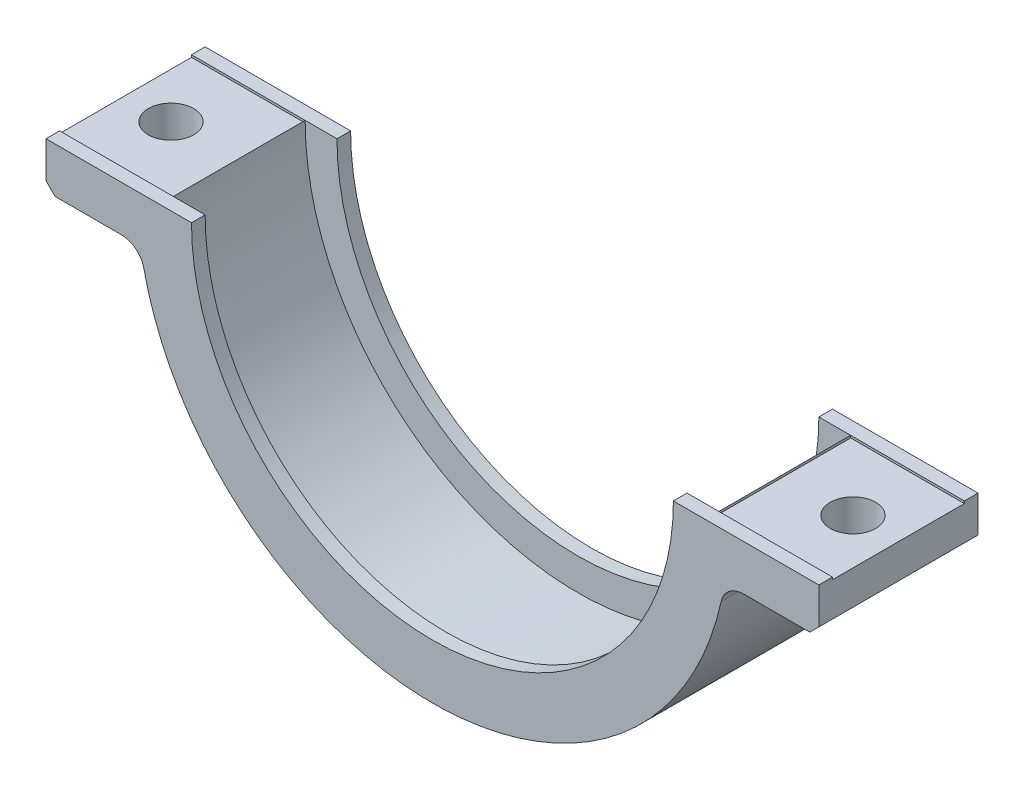
ISO-10303-21;
HEADER;
FILE_DESCRIPTION(('STEP AP214'),'2;1');
FILE_NAME('part.step','',(''),(''),'','','');
FILE_SCHEMA(('AUTOMOTIVE_DESIGN { 1 0 10303 214 1 1 1 1 }'));
ENDSEC;
DATA;
#1=APPLICATION_CONTEXT('core data for automotive mechanical design processes');
#2=APPLICATION_PROTOCOL_DEFINITION('international standard','automotive_design',2000,#1);
#3=PRODUCT_CONTEXT('',#1,'mechanical');
#4=PRODUCT('Part','Part','',(#3));
#5=PRODUCT_RELATED_PRODUCT_CATEGORY('part','',(#4));
#6=PRODUCT_DEFINITION_FORMATION('','',#4);
#7=PRODUCT_DEFINITION_CONTEXT('part definition',#1,'design');
#8=PRODUCT_DEFINITION('design','',#6,#7);
#9=PRODUCT_DEFINITION_SHAPE('','',#8);
#10=(LENGTH_UNIT() NAMED_UNIT(*) SI_UNIT(.MILLI.,.METRE.));
#11=(NAMED_UNIT(*) PLANE_ANGLE_UNIT() SI_UNIT($,.RADIAN.));
#12=(NAMED_UNIT(*) SI_UNIT($,.STERADIAN.) SOLID_ANGLE_UNIT());
#13=UNCERTAINTY_MEASURE_WITH_UNIT(LENGTH_MEASURE(1.E-05),#10,'distance_accuracy_value','');
#14=(GEOMETRIC_REPRESENTATION_CONTEXT(3) GLOBAL_UNCERTAINTY_ASSIGNED_CONTEXT((#13)) GLOBAL_UNIT_ASSIGNED_CONTEXT((#10,
#11,#12)) REPRESENTATION_CONTEXT('',''));
#15=CARTESIAN_POINT('',(0.,0.,0.));
#16=DIRECTION('',(0.,0.,1.));
#17=DIRECTION('',(1.,0.,0.));
#18=AXIS2_PLACEMENT_3D('',#15,#16,#17);
#19=CARTESIAN_POINT('',(0.,0.,14.5));
#20=DIRECTION('',(0.,1.,0.));
#21=DIRECTION('',(-1.,0.,0.));
#22=AXIS2_PLACEMENT_3D('',#19,#20,#21);
#23=PLANE('',#22);
#24=DIRECTION('',(1.,0.,0.));
#25=VECTOR('',#24,1.);
#26=CARTESIAN_POINT('',(0.,0.,14.5));
#27=LINE('',#26,#25);
#28=CARTESIAN_POINT('',(60.,0.,14.5));
#29=VERTEX_POINT('',#28);
#30=CARTESIAN_POINT('',(85.,0.,14.5));
#31=VERTEX_POINT('',#30);
#32=EDGE_CURVE('E206',#29,#31,#27,.T.);
#33=ORIENTED_EDGE('',*,*,#32,.F.);
#34=DIRECTION('',(-1.,0.,0.));
#35=VECTOR('',#34,1.);
#36=CARTESIAN_POINT('',(53.,0.,14.5));
#37=LINE('',#36,#35);
#38=CARTESIAN_POINT('',(53.,0.,14.5));
#39=VERTEX_POINT('',#38);
#40=EDGE_CURVE('E151',#29,#39,#37,.T.);
#41=ORIENTED_EDGE('',*,*,#40,.T.);
#42=DIRECTION('',(0.,0.,-1.));
#43=VECTOR('',#42,1.);
#44=CARTESIAN_POINT('',(53.,0.,17.5));
#45=LINE('',#44,#43);
#46=CARTESIAN_POINT('',(53.,0.,17.5));
#47=VERTEX_POINT('',#46);
#48=EDGE_CURVE('E138',#47,#39,#45,.T.);
#49=ORIENTED_EDGE('',*,*,#48,.F.);
#50=DIRECTION('',(-1.,0.,0.));
#51=VECTOR('',#50,1.);
#52=CARTESIAN_POINT('',(65.,0.,17.5));
#53=LINE('',#52,#51);
#54=CARTESIAN_POINT('',(85.,0.,17.5));
#55=VERTEX_POINT('',#54);
#56=EDGE_CURVE('E131',#55,#47,#53,.T.);
#57=ORIENTED_EDGE('',*,*,#56,.F.);
#58=DIRECTION('',(0.,0.,-1.));
#59=VECTOR('',#58,1.);
#60=CARTESIAN_POINT('',(85.,0.,14.5));
#61=LINE('',#60,#59);
#62=EDGE_CURVE('E113',#55,#31,#61,.T.);
#63=ORIENTED_EDGE('',*,*,#62,.T.);
#64=EDGE_LOOP('',(#33,#41,#49,#57,#63));
#65=FACE_BOUND('',#64,.T.);
#66=ADVANCED_FACE('F32',(#65),#23,.T.);
#67=CARTESIAN_POINT('',(75.,0.,0.));
#68=DIRECTION('',(0.,1.,0.));
#69=DIRECTION('',(0.,0.,1.));
#70=AXIS2_PLACEMENT_3D('',#67,#68,#69);
#71=CYLINDRICAL_SURFACE('',#70,4.99999999999999);
#72=CARTESIAN_POINT('',(75.,-10.,0.));
#73=DIRECTION('',(0.,-1.,0.));
#74=DIRECTION('',(0.,0.,-1.));
#75=AXIS2_PLACEMENT_3D('',#72,#73,#74);
#76=CIRCLE('',#75,4.99999999999999);
#77=CARTESIAN_POINT('',(75.,-10.,-4.99999999999999));
#78=VERTEX_POINT('',#77);
#79=EDGE_CURVE('E252',#78,#78,#76,.T.);
#80=ORIENTED_EDGE('',*,*,#79,.T.);
#81=EDGE_LOOP('',(#80));
#82=FACE_BOUND('',#81,.T.);
#83=CARTESIAN_POINT('',(75.,-0.5,0.));
#84=DIRECTION('',(0.,1.,0.));
#85=DIRECTION('',(0.,0.,1.));
#86=AXIS2_PLACEMENT_3D('',#83,#84,#85);
#87=CIRCLE('',#86,4.99999999999999);
#88=CARTESIAN_POINT('',(75.,-0.5,4.99999999999999));
#89=VERTEX_POINT('',#88);
#90=EDGE_CURVE('E188',#89,#89,#87,.F.);
#91=ORIENTED_EDGE('',*,*,#90,.F.);
#92=EDGE_LOOP('',(#91));
#93=FACE_BOUND('',#92,.T.);
#94=ADVANCED_FACE('F460',(#82,#93),#71,.F.);
#95=CARTESIAN_POINT('',(0.,0.,14.5));
#96=DIRECTION('',(0.,1.,0.));
#97=DIRECTION('',(0.,0.,1.));
#98=AXIS2_PLACEMENT_3D('',#95,#96,#97);
#99=PLANE('',#98);
#100=DIRECTION('',(-1.,0.,0.));
#101=VECTOR('',#100,1.);
#102=CARTESIAN_POINT('',(0.,0.,-14.5));
#103=LINE('',#102,#101);
#104=CARTESIAN_POINT('',(-60.,0.,-14.5));
#105=VERTEX_POINT('',#104);
#106=CARTESIAN_POINT('',(-85.,0.,-14.5));
#107=VERTEX_POINT('',#106);
#108=EDGE_CURVE('E187',#105,#107,#103,.T.);
#109=ORIENTED_EDGE('',*,*,#108,.F.);
#110=DIRECTION('',(1.,0.,0.));
#111=VECTOR('',#110,1.);
#112=CARTESIAN_POINT('',(-53.,0.,-14.5));
#113=LINE('',#112,#111);
#114=CARTESIAN_POINT('',(-53.,0.,-14.5));
#115=VERTEX_POINT('',#114);
#116=EDGE_CURVE('E260',#105,#115,#113,.T.);
#117=ORIENTED_EDGE('',*,*,#116,.T.);
#118=DIRECTION('',(0.,0.,1.));
#119=VECTOR('',#118,1.);
#120=CARTESIAN_POINT('',(-53.,0.,-17.5));
#121=LINE('',#120,#119);
#122=CARTESIAN_POINT('',(-53.,0.,-17.5));
#123=VERTEX_POINT('',#122);
#124=EDGE_CURVE('E154',#123,#115,#121,.T.);
#125=ORIENTED_EDGE('',*,*,#124,.F.);
#126=DIRECTION('',(1.,0.,0.));
#127=VECTOR('',#126,1.);
#128=CARTESIAN_POINT('',(-65.,0.,-17.5));
#129=LINE('',#128,#127);
#130=CARTESIAN_POINT('',(-85.,0.,-17.5));
#131=VERTEX_POINT('',#130);
#132=EDGE_CURVE('E292',#131,#123,#129,.T.);
#133=ORIENTED_EDGE('',*,*,#132,.F.);
#134=DIRECTION('',(0.,0.,-1.));
#135=VECTOR('',#134,1.);
#136=CARTESIAN_POINT('',(-85.,0.,14.5));
#137=LINE('',#136,#135);
#138=EDGE_CURVE('E451',#107,#131,#137,.T.);
#139=ORIENTED_EDGE('',*,*,#138,.F.);
#140=EDGE_LOOP('',(#109,#117,#125,#133,#139));
#141=FACE_BOUND('',#140,.T.);
#142=ADVANCED_FACE('F457',(#141),#99,.T.);
#143=CARTESIAN_POINT('',(-75.,0.,0.));
#144=DIRECTION('',(0.,1.,0.));
#145=DIRECTION('',(0.,0.,1.));
#146=AXIS2_PLACEMENT_3D('',#143,#144,#145);
#147=CYLINDRICAL_SURFACE('',#146,4.99999999999999);
#148=CARTESIAN_POINT('',(-75.,-10.,0.));
#149=DIRECTION('',(0.,1.,0.));
#150=DIRECTION('',(0.,0.,1.));
#151=AXIS2_PLACEMENT_3D('',#148,#149,#150);
#152=CIRCLE('',#151,4.99999999999999);
#153=CARTESIAN_POINT('',(-75.,-10.,4.99999999999999));
#154=VERTEX_POINT('',#153);
#155=EDGE_CURVE('E257',#154,#154,#152,.T.);
#156=ORIENTED_EDGE('',*,*,#155,.F.);
#157=EDGE_LOOP('',(#156));
#158=FACE_BOUND('',#157,.T.);
#159=CARTESIAN_POINT('',(-75.,-0.5,0.));
#160=DIRECTION('',(0.,1.,0.));
#161=DIRECTION('',(0.,0.,1.));
#162=AXIS2_PLACEMENT_3D('',#159,#160,#161);
#163=CIRCLE('',#162,4.99999999999999);
#164=CARTESIAN_POINT('',(-75.,-0.5,4.99999999999999));
#165=VERTEX_POINT('',#164);
#166=EDGE_CURVE('E198',#165,#165,#163,.F.);
#167=ORIENTED_EDGE('',*,*,#166,.F.);
#168=EDGE_LOOP('',(#167));
#169=FACE_BOUND('',#168,.T.);
#170=ADVANCED_FACE('F459',(#158,#169),#147,.F.);
#171=CARTESIAN_POINT('',(0.,-10.,14.5));
#172=DIRECTION('',(0.,1.,0.));
#173=DIRECTION('',(0.,0.,1.));
#174=AXIS2_PLACEMENT_3D('',#171,#172,#173);
#175=PLANE('',#174);
#176=ORIENTED_EDGE('',*,*,#155,.T.);
#177=EDGE_LOOP('',(#176));
#178=FACE_BOUND('',#177,.T.);
#179=DIRECTION('',(0.,0.,-1.));
#180=VECTOR('',#179,1.);
#181=CARTESIAN_POINT('',(-83.,-10.,14.5));
#182=LINE('',#181,#180);
#183=CARTESIAN_POINT('',(-83.,-10.,17.5));
#184=VERTEX_POINT('',#183);
#185=CARTESIAN_POINT('',(-83.,-10.,-17.5));
#186=VERTEX_POINT('',#185);
#187=EDGE_CURVE('E165',#184,#186,#182,.T.);
#188=ORIENTED_EDGE('',*,*,#187,.T.);
#189=DIRECTION('',(-1.,0.,0.));
#190=VECTOR('',#189,1.);
#191=CARTESIAN_POINT('',(-83.,-10.,-17.5));
#192=LINE('',#191,#190);
#193=CARTESIAN_POINT('',(-68.3739716558867,-10.,-17.5));
#194=VERTEX_POINT('',#193);
#195=EDGE_CURVE('E283',#194,#186,#192,.T.);
#196=ORIENTED_EDGE('',*,*,#195,.F.);
#197=DIRECTION('',(0.,0.,-1.));
#198=VECTOR('',#197,1.);
#199=CARTESIAN_POINT('',(-68.3739716558867,-10.,14.5));
#200=LINE('',#199,#198);
#201=CARTESIAN_POINT('',(-68.3739716558867,-10.,17.5));
#202=VERTEX_POINT('',#201);
#203=EDGE_CURVE('E11',#202,#194,#200,.T.);
#204=ORIENTED_EDGE('',*,*,#203,.F.);
#205=DIRECTION('',(1.,0.,0.));
#206=VECTOR('',#205,1.);
#207=CARTESIAN_POINT('',(-83.,-10.,17.5));
#208=LINE('',#207,#206);
#209=EDGE_CURVE('E315',#184,#202,#208,.T.);
#210=ORIENTED_EDGE('',*,*,#209,.F.);
#211=EDGE_LOOP('',(#188,#196,#204,#210));
#212=FACE_BOUND('',#211,.T.);
#213=ADVANCED_FACE('F34',(#178,#212),#175,.F.);
#214=CARTESIAN_POINT('',(-68.3739716558867,-15.,14.5));
#215=DIRECTION('',(0.,0.,-1.));
#216=DIRECTION('',(-1.,0.,0.));
#217=AXIS2_PLACEMENT_3D('',#214,#215,#216);
#218=CYLINDRICAL_SURFACE('',#217,5.);
#219=ORIENTED_EDGE('',*,*,#203,.T.);
#220=CARTESIAN_POINT('',(-68.3739716558867,-15.,-17.5));
#221=DIRECTION('',(0.,0.,1.));
#222=DIRECTION('',(-1.,0.,0.));
#223=AXIS2_PLACEMENT_3D('',#220,#221,#222);
#224=CIRCLE('',#223,4.99999999999999);
#225=CARTESIAN_POINT('',(-63.4901165376091,-13.9285714285714,-17.5));
#226=VERTEX_POINT('',#225);
#227=EDGE_CURVE('E280',#226,#194,#224,.T.);
#228=ORIENTED_EDGE('',*,*,#227,.F.);
#229=DIRECTION('',(0.,0.,-1.));
#230=VECTOR('',#229,1.);
#231=CARTESIAN_POINT('',(-63.4901165376091,-13.9285714285714,14.5));
#232=LINE('',#231,#230);
#233=CARTESIAN_POINT('',(-63.4901165376091,-13.9285714285714,17.5));
#234=VERTEX_POINT('',#233);
#235=EDGE_CURVE('E41',#234,#226,#232,.T.);
#236=ORIENTED_EDGE('',*,*,#235,.F.);
#237=CARTESIAN_POINT('',(-68.3739716558867,-15.,17.5));
#238=DIRECTION('',(0.,0.,-1.));
#239=DIRECTION('',(-1.,0.,0.));
#240=AXIS2_PLACEMENT_3D('',#237,#238,#239);
#241=CIRCLE('',#240,4.99999999999999);
#242=EDGE_CURVE('E318',#202,#234,#241,.T.);
#243=ORIENTED_EDGE('',*,*,#242,.F.);
#244=EDGE_LOOP('',(#219,#228,#236,#243));
#245=FACE_BOUND('',#244,.T.);
#246=ADVANCED_FACE('F500',(#245),#218,.F.);
#247=CARTESIAN_POINT('',(0.,0.,14.5));
#248=DIRECTION('',(0.,0.,-1.));
#249=DIRECTION('',(-1.,0.,0.));
#250=AXIS2_PLACEMENT_3D('',#247,#248,#249);
#251=CYLINDRICAL_SURFACE('',#250,65.);
#252=ORIENTED_EDGE('',*,*,#235,.T.);
#253=CARTESIAN_POINT('',(0.,0.,-17.5));
#254=DIRECTION('',(0.,0.,-1.));
#255=DIRECTION('',(-1.,0.,0.));
#256=AXIS2_PLACEMENT_3D('',#253,#254,#255);
#257=CIRCLE('',#256,65.);
#258=CARTESIAN_POINT('',(63.4901165376091,-13.9285714285714,-17.5));
#259=VERTEX_POINT('',#258);
#260=EDGE_CURVE('E277',#259,#226,#257,.T.);
#261=ORIENTED_EDGE('',*,*,#260,.F.);
#262=DIRECTION('',(0.,0.,-1.));
#263=VECTOR('',#262,1.);
#264=CARTESIAN_POINT('',(63.4901165376091,-13.9285714285715,14.5));
#265=LINE('',#264,#263);
#266=CARTESIAN_POINT('',(63.4901165376091,-13.9285714285714,17.5));
#267=VERTEX_POINT('',#266);
#268=EDGE_CURVE('E346',#267,#259,#265,.T.);
#269=ORIENTED_EDGE('',*,*,#268,.F.);
#270=CARTESIAN_POINT('',(0.,0.,17.5));
#271=DIRECTION('',(0.,0.,1.));
#272=DIRECTION('',(1.,0.,0.));
#273=AXIS2_PLACEMENT_3D('',#270,#271,#272);
#274=CIRCLE('',#273,65.);
#275=EDGE_CURVE('E321',#234,#267,#274,.T.);
#276=ORIENTED_EDGE('',*,*,#275,.F.);
#277=EDGE_LOOP('',(#252,#261,#269,#276));
#278=FACE_BOUND('',#277,.T.);
#279=ADVANCED_FACE('F497',(#278),#251,.T.);
#280=CARTESIAN_POINT('',(68.3739716558867,-15.,14.5));
#281=DIRECTION('',(0.,0.,-1.));
#282=DIRECTION('',(-1.,0.,0.));
#283=AXIS2_PLACEMENT_3D('',#280,#281,#282);
#284=CYLINDRICAL_SURFACE('',#283,5.);
#285=ORIENTED_EDGE('',*,*,#268,.T.);
#286=CARTESIAN_POINT('',(68.3739716558867,-15.,-17.5));
#287=DIRECTION('',(0.,0.,1.));
#288=DIRECTION('',(1.,0.,0.));
#289=AXIS2_PLACEMENT_3D('',#286,#287,#288);
#290=CIRCLE('',#289,4.99999999999999);
#291=CARTESIAN_POINT('',(68.3739716558867,-10.,-17.5));
#292=VERTEX_POINT('',#291);
#293=EDGE_CURVE('E274',#292,#259,#290,.T.);
#294=ORIENTED_EDGE('',*,*,#293,.F.);
#295=DIRECTION('',(0.,0.,-1.));
#296=VECTOR('',#295,1.);
#297=CARTESIAN_POINT('',(68.3739716558867,-10.,14.5));
#298=LINE('',#297,#296);
#299=CARTESIAN_POINT('',(68.3739716558867,-10.,17.5));
#300=VERTEX_POINT('',#299);
#301=EDGE_CURVE('E341',#300,#292,#298,.T.);
#302=ORIENTED_EDGE('',*,*,#301,.F.);
#303=CARTESIAN_POINT('',(68.3739716558867,-15.,17.5));
#304=DIRECTION('',(0.,0.,-1.));
#305=DIRECTION('',(1.,0.,0.));
#306=AXIS2_PLACEMENT_3D('',#303,#304,#305);
#307=CIRCLE('',#306,5.);
#308=EDGE_CURVE('E324',#267,#300,#307,.T.);
#309=ORIENTED_EDGE('',*,*,#308,.F.);
#310=EDGE_LOOP('',(#285,#294,#302,#309));
#311=FACE_BOUND('',#310,.T.);
#312=ADVANCED_FACE('F493',(#311),#284,.F.);
#313=CARTESIAN_POINT('',(0.,-10.,14.5));
#314=DIRECTION('',(0.,-1.,0.));
#315=DIRECTION('',(0.,0.,-1.));
#316=AXIS2_PLACEMENT_3D('',#313,#314,#315);
#317=PLANE('',#316);
#318=ORIENTED_EDGE('',*,*,#79,.F.);
#319=EDGE_LOOP('',(#318));
#320=FACE_BOUND('',#319,.T.);
#321=ORIENTED_EDGE('',*,*,#301,.T.);
#322=DIRECTION('',(-1.,0.,0.));
#323=VECTOR('',#322,1.);
#324=CARTESIAN_POINT('',(83.,-10.,-17.5));
#325=LINE('',#324,#323);
#326=CARTESIAN_POINT('',(83.,-10.,-17.5));
#327=VERTEX_POINT('',#326);
#328=EDGE_CURVE('E271',#327,#292,#325,.T.);
#329=ORIENTED_EDGE('',*,*,#328,.F.);
#330=DIRECTION('',(0.,0.,-1.));
#331=VECTOR('',#330,1.);
#332=CARTESIAN_POINT('',(83.,-10.,14.5));
#333=LINE('',#332,#331);
#334=CARTESIAN_POINT('',(83.,-10.,17.5));
#335=VERTEX_POINT('',#334);
#336=EDGE_CURVE('E337',#335,#327,#333,.T.);
#337=ORIENTED_EDGE('',*,*,#336,.F.);
#338=DIRECTION('',(1.,0.,0.));
#339=VECTOR('',#338,1.);
#340=CARTESIAN_POINT('',(83.,-10.,17.5));
#341=LINE('',#340,#339);
#342=EDGE_CURVE('E327',#300,#335,#341,.T.);
#343=ORIENTED_EDGE('',*,*,#342,.F.);
#344=EDGE_LOOP('',(#321,#329,#337,#343));
#345=FACE_BOUND('',#344,.T.);
#346=ADVANCED_FACE('F488',(#320,#345),#317,.T.);
#347=CARTESIAN_POINT('',(46.5,-46.5,14.5));
#348=DIRECTION('',(0.707106781186547,-0.707106781186548,0.));
#349=DIRECTION('',(0.707106781186548,0.707106781186547,0.));
#350=AXIS2_PLACEMENT_3D('',#347,#348,#349);
#351=PLANE('',#350);
#352=ORIENTED_EDGE('',*,*,#336,.T.);
#353=DIRECTION('',(-0.707106781186547,-0.707106781186547,0.));
#354=VECTOR('',#353,1.);
#355=CARTESIAN_POINT('',(85.,-8.,-17.5));
#356=LINE('',#355,#354);
#357=CARTESIAN_POINT('',(85.,-8.,-17.5));
#358=VERTEX_POINT('',#357);
#359=EDGE_CURVE('E268',#358,#327,#356,.T.);
#360=ORIENTED_EDGE('',*,*,#359,.F.);
#361=DIRECTION('',(0.,0.,-1.));
#362=VECTOR('',#361,1.);
#363=CARTESIAN_POINT('',(85.,-8.,14.5));
#364=LINE('',#363,#362);
#365=CARTESIAN_POINT('',(85.,-8.,17.5));
#366=VERTEX_POINT('',#365);
#367=EDGE_CURVE('E125',#366,#358,#364,.T.);
#368=ORIENTED_EDGE('',*,*,#367,.F.);
#369=DIRECTION('',(0.707106781186548,0.707106781186547,0.));
#370=VECTOR('',#369,1.);
#371=CARTESIAN_POINT('',(85.,-8.,17.5));
#372=LINE('',#371,#370);
#373=EDGE_CURVE('E135',#335,#366,#372,.T.);
#374=ORIENTED_EDGE('',*,*,#373,.F.);
#375=EDGE_LOOP('',(#352,#360,#368,#374));
#376=FACE_BOUND('',#375,.T.);
#377=ADVANCED_FACE('F334',(#376),#351,.T.);
#378=CARTESIAN_POINT('',(85.,0.,14.5));
#379=DIRECTION('',(1.,0.,0.));
#380=DIRECTION('',(0.,0.,-1.));
#381=AXIS2_PLACEMENT_3D('',#378,#379,#380);
#382=PLANE('',#381);
#383=DIRECTION('',(0.,1.,0.));
#384=VECTOR('',#383,1.);
#385=CARTESIAN_POINT('',(85.,-0.5,14.5));
#386=LINE('',#385,#384);
#387=CARTESIAN_POINT('',(85.,-0.5,14.5));
#388=VERTEX_POINT('',#387);
#389=EDGE_CURVE('E121',#388,#31,#386,.T.);
#390=ORIENTED_EDGE('',*,*,#389,.T.);
#391=ORIENTED_EDGE('',*,*,#62,.F.);
#392=DIRECTION('',(0.,1.,0.));
#393=VECTOR('',#392,1.);
#394=CARTESIAN_POINT('',(85.,0.,17.5));
#395=LINE('',#394,#393);
#396=EDGE_CURVE('E117',#366,#55,#395,.T.);
#397=ORIENTED_EDGE('',*,*,#396,.F.);
#398=ORIENTED_EDGE('',*,*,#367,.T.);
#399=DIRECTION('',(0.,-1.,0.));
#400=VECTOR('',#399,1.);
#401=CARTESIAN_POINT('',(85.,0.,-17.5));
#402=LINE('',#401,#400);
#403=CARTESIAN_POINT('',(85.,0.,-17.5));
#404=VERTEX_POINT('',#403);
#405=EDGE_CURVE('E264',#404,#358,#402,.T.);
#406=ORIENTED_EDGE('',*,*,#405,.F.);
#407=CARTESIAN_POINT('',(85.,0.,-14.5));
#408=VERTEX_POINT('',#407);
#409=EDGE_CURVE('E126',#408,#404,#61,.T.);
#410=ORIENTED_EDGE('',*,*,#409,.F.);
#411=DIRECTION('',(0.,1.,0.));
#412=VECTOR('',#411,1.);
#413=CARTESIAN_POINT('',(85.,-0.5,-14.5));
#414=LINE('',#413,#412);
#415=CARTESIAN_POINT('',(85.,-0.5,-14.5));
#416=VERTEX_POINT('',#415);
#417=EDGE_CURVE('E213',#416,#408,#414,.T.);
#418=ORIENTED_EDGE('',*,*,#417,.F.);
#419=DIRECTION('',(0.,0.,-1.));
#420=VECTOR('',#419,1.);
#421=CARTESIAN_POINT('',(85.,-0.5,0.));
#422=LINE('',#421,#420);
#423=EDGE_CURVE('E220',#388,#416,#422,.T.);
#424=ORIENTED_EDGE('',*,*,#423,.F.);
#425=EDGE_LOOP('',(#390,#391,#397,#398,#406,#410,#418,#424));
#426=FACE_BOUND('',#425,.T.);
#427=ADVANCED_FACE('F115',(#426),#382,.T.);
#428=DIRECTION('',(-1.,0.,0.));
#429=VECTOR('',#428,1.);
#430=CARTESIAN_POINT('',(0.,0.,-14.5));
#431=LINE('',#430,#429);
#432=CARTESIAN_POINT('',(60.,0.,-14.5));
#433=VERTEX_POINT('',#432);
#434=EDGE_CURVE('E203',#408,#433,#431,.T.);
#435=ORIENTED_EDGE('',*,*,#434,.F.);
#436=ORIENTED_EDGE('',*,*,#409,.T.);
#437=DIRECTION('',(1.,0.,0.));
#438=VECTOR('',#437,1.);
#439=CARTESIAN_POINT('',(65.,0.,-17.5));
#440=LINE('',#439,#438);
#441=CARTESIAN_POINT('',(53.,0.,-17.5));
#442=VERTEX_POINT('',#441);
#443=EDGE_CURVE('E261',#442,#404,#440,.T.);
#444=ORIENTED_EDGE('',*,*,#443,.F.);
#445=DIRECTION('',(0.,0.,1.));
#446=VECTOR('',#445,1.);
#447=CARTESIAN_POINT('',(53.,0.,-17.5));
#448=LINE('',#447,#446);
#449=CARTESIAN_POINT('',(53.,0.,-14.5));
#450=VERTEX_POINT('',#449);
#451=EDGE_CURVE('E298',#442,#450,#448,.T.);
#452=ORIENTED_EDGE('',*,*,#451,.T.);
#453=DIRECTION('',(1.,0.,0.));
#454=VECTOR('',#453,1.);
#455=CARTESIAN_POINT('',(65.,0.,-14.5));
#456=LINE('',#455,#454);
#457=EDGE_CURVE('E265',#450,#433,#456,.T.);
#458=ORIENTED_EDGE('',*,*,#457,.T.);
#459=EDGE_LOOP('',(#435,#436,#444,#452,#458));
#460=FACE_BOUND('',#459,.T.);
#461=ADVANCED_FACE('F360',(#460),#23,.T.);
#462=CARTESIAN_POINT('',(0.,0.,14.5));
#463=DIRECTION('',(0.,0.,-1.));
#464=DIRECTION('',(-1.,0.,0.));
#465=AXIS2_PLACEMENT_3D('',#462,#463,#464);
#466=CYLINDRICAL_SURFACE('',#465,60.);
#467=CARTESIAN_POINT('',(0.,0.,-14.5));
#468=DIRECTION('',(0.,0.,1.));
#469=DIRECTION('',(1.,0.,0.));
#470=AXIS2_PLACEMENT_3D('',#467,#468,#469);
#471=CIRCLE('',#470,60.);
#472=EDGE_CURVE('E166',#105,#433,#471,.T.);
#473=ORIENTED_EDGE('',*,*,#472,.F.);
#474=DIRECTION('',(0.,0.,-1.));
#475=VECTOR('',#474,1.);
#476=CARTESIAN_POINT('',(-60.,0.,14.5));
#477=LINE('',#476,#475);
#478=CARTESIAN_POINT('',(-60.,0.,14.5));
#479=VERTEX_POINT('',#478);
#480=EDGE_CURVE('E169',#479,#105,#477,.T.);
#481=ORIENTED_EDGE('',*,*,#480,.F.);
#482=CARTESIAN_POINT('',(0.,0.,14.5));
#483=DIRECTION('',(0.,0.,1.));
#484=DIRECTION('',(1.,0.,0.));
#485=AXIS2_PLACEMENT_3D('',#482,#483,#484);
#486=CIRCLE('',#485,60.);
#487=EDGE_CURVE('E161',#479,#29,#486,.T.);
#488=ORIENTED_EDGE('',*,*,#487,.T.);
#489=DIRECTION('',(0.,0.,-1.));
#490=VECTOR('',#489,1.);
#491=CARTESIAN_POINT('',(60.,0.,14.5));
#492=LINE('',#491,#490);
#493=EDGE_CURVE('E172',#29,#433,#492,.T.);
#494=ORIENTED_EDGE('',*,*,#493,.T.);
#495=EDGE_LOOP('',(#473,#481,#488,#494));
#496=FACE_BOUND('',#495,.T.);
#497=ADVANCED_FACE('F474',(#496),#466,.F.);
#498=DIRECTION('',(1.,0.,0.));
#499=VECTOR('',#498,1.);
#500=CARTESIAN_POINT('',(0.,0.,14.5));
#501=LINE('',#500,#499);
#502=CARTESIAN_POINT('',(-85.,0.,14.5));
#503=VERTEX_POINT('',#502);
#504=EDGE_CURVE('E184',#503,#479,#501,.T.);
#505=ORIENTED_EDGE('',*,*,#504,.F.);
#506=CARTESIAN_POINT('',(-85.,0.,17.5));
#507=VERTEX_POINT('',#506);
#508=EDGE_CURVE('E81',#507,#503,#137,.T.);
#509=ORIENTED_EDGE('',*,*,#508,.F.);
#510=DIRECTION('',(-1.,0.,0.));
#511=VECTOR('',#510,1.);
#512=CARTESIAN_POINT('',(-65.,0.,17.5));
#513=LINE('',#512,#511);
#514=CARTESIAN_POINT('',(-53.,0.,17.5));
#515=VERTEX_POINT('',#514);
#516=EDGE_CURVE('E58',#515,#507,#513,.T.);
#517=ORIENTED_EDGE('',*,*,#516,.F.);
#518=DIRECTION('',(0.,0.,-1.));
#519=VECTOR('',#518,1.);
#520=CARTESIAN_POINT('',(-53.,0.,17.5));
#521=LINE('',#520,#519);
#522=CARTESIAN_POINT('',(-53.,0.,14.5));
#523=VERTEX_POINT('',#522);
#524=EDGE_CURVE('E142',#515,#523,#521,.T.);
#525=ORIENTED_EDGE('',*,*,#524,.T.);
#526=DIRECTION('',(-1.,0.,0.));
#527=VECTOR('',#526,1.);
#528=CARTESIAN_POINT('',(-65.,0.,14.5));
#529=LINE('',#528,#527);
#530=EDGE_CURVE('E75',#523,#479,#529,.T.);
#531=ORIENTED_EDGE('',*,*,#530,.T.);
#532=EDGE_LOOP('',(#505,#509,#517,#525,#531));
#533=FACE_BOUND('',#532,.T.);
#534=ADVANCED_FACE('F462',(#533),#99,.T.);
#535=CARTESIAN_POINT('',(-85.,0.,14.5));
#536=DIRECTION('',(1.,0.,0.));
#537=DIRECTION('',(0.,0.,-1.));
#538=AXIS2_PLACEMENT_3D('',#535,#536,#537);
#539=PLANE('',#538);
#540=DIRECTION('',(0.,0.,1.));
#541=VECTOR('',#540,1.);
#542=CARTESIAN_POINT('',(-85.,-0.5,0.));
#543=LINE('',#542,#541);
#544=CARTESIAN_POINT('',(-85.,-0.5,-14.5));
#545=VERTEX_POINT('',#544);
#546=CARTESIAN_POINT('',(-85.,-0.5,14.5));
#547=VERTEX_POINT('',#546);
#548=EDGE_CURVE('E242',#545,#547,#543,.T.);
#549=ORIENTED_EDGE('',*,*,#548,.F.);
#550=DIRECTION('',(0.,1.,0.));
#551=VECTOR('',#550,1.);
#552=CARTESIAN_POINT('',(-85.,-0.5,-14.5));
#553=LINE('',#552,#551);
#554=EDGE_CURVE('E193',#545,#107,#553,.T.);
#555=ORIENTED_EDGE('',*,*,#554,.T.);
#556=ORIENTED_EDGE('',*,*,#138,.T.);
#557=DIRECTION('',(0.,1.,0.));
#558=VECTOR('',#557,1.);
#559=CARTESIAN_POINT('',(-85.,0.,-17.5));
#560=LINE('',#559,#558);
#561=CARTESIAN_POINT('',(-85.,-8.,-17.5));
#562=VERTEX_POINT('',#561);
#563=EDGE_CURVE('E289',#562,#131,#560,.T.);
#564=ORIENTED_EDGE('',*,*,#563,.F.);
#565=DIRECTION('',(0.,0.,-1.));
#566=VECTOR('',#565,1.);
#567=CARTESIAN_POINT('',(-85.,-8.,14.5));
#568=LINE('',#567,#566);
#569=CARTESIAN_POINT('',(-85.,-8.,17.5));
#570=VERTEX_POINT('',#569);
#571=EDGE_CURVE('E455',#570,#562,#568,.T.);
#572=ORIENTED_EDGE('',*,*,#571,.F.);
#573=DIRECTION('',(0.,-1.,0.));
#574=VECTOR('',#573,1.);
#575=CARTESIAN_POINT('',(-85.,0.,17.5));
#576=LINE('',#575,#574);
#577=EDGE_CURVE('E309',#507,#570,#576,.T.);
#578=ORIENTED_EDGE('',*,*,#577,.F.);
#579=ORIENTED_EDGE('',*,*,#508,.T.);
#580=DIRECTION('',(0.,1.,0.));
#581=VECTOR('',#580,1.);
#582=CARTESIAN_POINT('',(-85.,-0.5,14.5));
#583=LINE('',#582,#581);
#584=EDGE_CURVE('E181',#547,#503,#583,.T.);
#585=ORIENTED_EDGE('',*,*,#584,.F.);
#586=EDGE_LOOP('',(#549,#555,#556,#564,#572,#578,#579,#585));
#587=FACE_BOUND('',#586,.T.);
#588=ADVANCED_FACE('F453',(#587),#539,.F.);
#589=CARTESIAN_POINT('',(-46.5,-46.5,14.5));
#590=DIRECTION('',(0.707106781186547,0.707106781186548,0.));
#591=DIRECTION('',(-0.707106781186548,0.707106781186547,0.));
#592=AXIS2_PLACEMENT_3D('',#589,#590,#591);
#593=PLANE('',#592);
#594=ORIENTED_EDGE('',*,*,#571,.T.);
#595=DIRECTION('',(-0.707106781186547,0.707106781186547,0.));
#596=VECTOR('',#595,1.);
#597=CARTESIAN_POINT('',(-85.,-8.,-17.5));
#598=LINE('',#597,#596);
#599=EDGE_CURVE('E286',#186,#562,#598,.T.);
#600=ORIENTED_EDGE('',*,*,#599,.F.);
#601=ORIENTED_EDGE('',*,*,#187,.F.);
#602=DIRECTION('',(0.707106781186548,-0.707106781186547,0.));
#603=VECTOR('',#602,1.);
#604=CARTESIAN_POINT('',(-85.,-8.,17.5));
#605=LINE('',#604,#603);
#606=EDGE_CURVE('E312',#570,#184,#605,.T.);
#607=ORIENTED_EDGE('',*,*,#606,.F.);
#608=EDGE_LOOP('',(#594,#600,#601,#607));
#609=FACE_BOUND('',#608,.T.);
#610=ADVANCED_FACE('F561',(#609),#593,.F.);
#611=CARTESIAN_POINT('',(-68.3739716558867,-15.,14.5));
#612=DIRECTION('',(0.,0.,-1.));
#613=DIRECTION('',(-1.,0.,0.));
#614=AXIS2_PLACEMENT_3D('',#611,#612,#613);
#615=PLANE('',#614);
#616=ORIENTED_EDGE('',*,*,#487,.F.);
#617=ORIENTED_EDGE('',*,*,#530,.F.);
#618=CARTESIAN_POINT('',(0.,0.,14.5));
#619=DIRECTION('',(0.,0.,-1.));
#620=DIRECTION('',(1.,0.,0.));
#621=AXIS2_PLACEMENT_3D('',#618,#619,#620);
#622=CIRCLE('',#621,53.);
#623=EDGE_CURVE('E148',#39,#523,#622,.T.);
#624=ORIENTED_EDGE('',*,*,#623,.F.);
#625=ORIENTED_EDGE('',*,*,#40,.F.);
#626=EDGE_LOOP('',(#616,#617,#624,#625));
#627=FACE_BOUND('',#626,.T.);
#628=ADVANCED_FACE('F524',(#627),#615,.T.);
#629=CARTESIAN_POINT('',(0.,0.,17.5));
#630=DIRECTION('',(0.,0.,-1.));
#631=DIRECTION('',(-1.,0.,0.));
#632=AXIS2_PLACEMENT_3D('',#629,#630,#631);
#633=CYLINDRICAL_SURFACE('',#632,53.);
#634=ORIENTED_EDGE('',*,*,#623,.T.);
#635=ORIENTED_EDGE('',*,*,#524,.F.);
#636=CARTESIAN_POINT('',(0.,0.,17.5));
#637=DIRECTION('',(0.,0.,-1.));
#638=DIRECTION('',(1.,0.,0.));
#639=AXIS2_PLACEMENT_3D('',#636,#637,#638);
#640=CIRCLE('',#639,53.);
#641=EDGE_CURVE('E140',#47,#515,#640,.T.);
#642=ORIENTED_EDGE('',*,*,#641,.F.);
#643=ORIENTED_EDGE('',*,*,#48,.T.);
#644=EDGE_LOOP('',(#634,#635,#642,#643));
#645=FACE_BOUND('',#644,.T.);
#646=ADVANCED_FACE('F520',(#645),#633,.F.);
#647=CARTESIAN_POINT('',(-68.3739716558867,-15.,17.5));
#648=DIRECTION('',(0.,0.,-1.));
#649=DIRECTION('',(-1.,0.,0.));
#650=AXIS2_PLACEMENT_3D('',#647,#648,#649);
#651=PLANE('',#650);
#652=ORIENTED_EDGE('',*,*,#516,.T.);
#653=ORIENTED_EDGE('',*,*,#577,.T.);
#654=ORIENTED_EDGE('',*,*,#606,.T.);
#655=ORIENTED_EDGE('',*,*,#209,.T.);
#656=ORIENTED_EDGE('',*,*,#242,.T.);
#657=ORIENTED_EDGE('',*,*,#275,.T.);
#658=ORIENTED_EDGE('',*,*,#308,.T.);
#659=ORIENTED_EDGE('',*,*,#342,.T.);
#660=ORIENTED_EDGE('',*,*,#373,.T.);
#661=ORIENTED_EDGE('',*,*,#396,.T.);
#662=ORIENTED_EDGE('',*,*,#56,.T.);
#663=ORIENTED_EDGE('',*,*,#641,.T.);
#664=EDGE_LOOP('',(#652,#653,#654,#655,#656,#657,#658,#659,#660,#661,#662,#663));
#665=FACE_BOUND('',#664,.T.);
#666=ADVANCED_FACE('F130',(#665),#651,.F.);
#667=CARTESIAN_POINT('',(0.,0.,-17.5));
#668=DIRECTION('',(0.,0.,1.));
#669=DIRECTION('',(1.,0.,0.));
#670=AXIS2_PLACEMENT_3D('',#667,#668,#669);
#671=CYLINDRICAL_SURFACE('',#670,53.);
#672=CARTESIAN_POINT('',(0.,0.,-14.5));
#673=DIRECTION('',(0.,0.,1.));
#674=DIRECTION('',(-1.,0.,0.));
#675=AXIS2_PLACEMENT_3D('',#672,#673,#674);
#676=CIRCLE('',#675,53.);
#677=EDGE_CURVE('E301',#115,#450,#676,.T.);
#678=ORIENTED_EDGE('',*,*,#677,.T.);
#679=ORIENTED_EDGE('',*,*,#451,.F.);
#680=CARTESIAN_POINT('',(0.,0.,-17.5));
#681=DIRECTION('',(0.,0.,1.));
#682=DIRECTION('',(-1.,0.,0.));
#683=AXIS2_PLACEMENT_3D('',#680,#681,#682);
#684=CIRCLE('',#683,53.);
#685=EDGE_CURVE('E295',#123,#442,#684,.T.);
#686=ORIENTED_EDGE('',*,*,#685,.F.);
#687=ORIENTED_EDGE('',*,*,#124,.T.);
#688=EDGE_LOOP('',(#678,#679,#686,#687));
#689=FACE_BOUND('',#688,.T.);
#690=ADVANCED_FACE('F378',(#689),#671,.F.);
#691=CARTESIAN_POINT('',(68.3739716558867,-15.,-17.5));
#692=DIRECTION('',(0.,0.,1.));
#693=DIRECTION('',(1.,0.,0.));
#694=AXIS2_PLACEMENT_3D('',#691,#692,#693);
#695=PLANE('',#694);
#696=ORIENTED_EDGE('',*,*,#443,.T.);
#697=ORIENTED_EDGE('',*,*,#405,.T.);
#698=ORIENTED_EDGE('',*,*,#359,.T.);
#699=ORIENTED_EDGE('',*,*,#328,.T.);
#700=ORIENTED_EDGE('',*,*,#293,.T.);
#701=ORIENTED_EDGE('',*,*,#260,.T.);
#702=ORIENTED_EDGE('',*,*,#227,.T.);
#703=ORIENTED_EDGE('',*,*,#195,.T.);
#704=ORIENTED_EDGE('',*,*,#599,.T.);
#705=ORIENTED_EDGE('',*,*,#563,.T.);
#706=ORIENTED_EDGE('',*,*,#132,.T.);
#707=ORIENTED_EDGE('',*,*,#685,.T.);
#708=EDGE_LOOP('',(#696,#697,#698,#699,#700,#701,#702,#703,#704,#705,#706,#707));
#709=FACE_BOUND('',#708,.T.);
#710=ADVANCED_FACE('F368',(#709),#695,.F.);
#711=CARTESIAN_POINT('',(68.3739716558867,-15.,-14.5));
#712=DIRECTION('',(0.,0.,1.));
#713=DIRECTION('',(1.,0.,0.));
#714=AXIS2_PLACEMENT_3D('',#711,#712,#713);
#715=PLANE('',#714);
#716=ORIENTED_EDGE('',*,*,#116,.F.);
#717=ORIENTED_EDGE('',*,*,#472,.T.);
#718=ORIENTED_EDGE('',*,*,#457,.F.);
#719=ORIENTED_EDGE('',*,*,#677,.F.);
#720=EDGE_LOOP('',(#716,#717,#718,#719));
#721=FACE_BOUND('',#720,.T.);
#722=ADVANCED_FACE('F389',(#721),#715,.T.);
#723=CARTESIAN_POINT('',(0.,-0.5,-14.5));
#724=DIRECTION('',(0.,0.,-1.));
#725=DIRECTION('',(-1.,0.,0.));
#726=AXIS2_PLACEMENT_3D('',#723,#724,#725);
#727=PLANE('',#726);
#728=ORIENTED_EDGE('',*,*,#108,.T.);
#729=ORIENTED_EDGE('',*,*,#554,.F.);
#730=DIRECTION('',(-1.,0.,0.));
#731=VECTOR('',#730,1.);
#732=CARTESIAN_POINT('',(0.,-0.5,-14.5));
#733=LINE('',#732,#731);
#734=CARTESIAN_POINT('',(-60.,-0.5,-14.5));
#735=VERTEX_POINT('',#734);
#736=EDGE_CURVE('E49',#735,#545,#733,.T.);
#737=ORIENTED_EDGE('',*,*,#736,.F.);
#738=DIRECTION('',(0.,1.,0.));
#739=VECTOR('',#738,1.);
#740=CARTESIAN_POINT('',(-60.,-0.5,-14.5));
#741=LINE('',#740,#739);
#742=EDGE_CURVE('E180',#735,#105,#741,.T.);
#743=ORIENTED_EDGE('',*,*,#742,.T.);
#744=EDGE_LOOP('',(#728,#729,#737,#743));
#745=FACE_BOUND('',#744,.T.);
#746=ADVANCED_FACE('F545',(#745),#727,.F.);
#747=CARTESIAN_POINT('',(-60.,-0.5,0.));
#748=DIRECTION('',(1.,0.,0.));
#749=DIRECTION('',(0.,0.,-1.));
#750=AXIS2_PLACEMENT_3D('',#747,#748,#749);
#751=PLANE('',#750);
#752=ORIENTED_EDGE('',*,*,#480,.T.);
#753=ORIENTED_EDGE('',*,*,#742,.F.);
#754=DIRECTION('',(0.,0.,-1.));
#755=VECTOR('',#754,1.);
#756=CARTESIAN_POINT('',(-60.,-0.5,0.));
#757=LINE('',#756,#755);
#758=CARTESIAN_POINT('',(-60.,-0.5,14.5));
#759=VERTEX_POINT('',#758);
#760=EDGE_CURVE('E247',#759,#735,#757,.T.);
#761=ORIENTED_EDGE('',*,*,#760,.F.);
#762=DIRECTION('',(0.,1.,0.));
#763=VECTOR('',#762,1.);
#764=CARTESIAN_POINT('',(-60.,-0.5,14.5));
#765=LINE('',#764,#763);
#766=EDGE_CURVE('E177',#759,#479,#765,.T.);
#767=ORIENTED_EDGE('',*,*,#766,.T.);
#768=EDGE_LOOP('',(#752,#753,#761,#767));
#769=FACE_BOUND('',#768,.T.);
#770=ADVANCED_FACE('F527',(#769),#751,.F.);
#771=CARTESIAN_POINT('',(0.,-0.5,14.5));
#772=DIRECTION('',(0.,0.,1.));
#773=DIRECTION('',(1.,0.,0.));
#774=AXIS2_PLACEMENT_3D('',#771,#772,#773);
#775=PLANE('',#774);
#776=ORIENTED_EDGE('',*,*,#504,.T.);
#777=ORIENTED_EDGE('',*,*,#766,.F.);
#778=DIRECTION('',(1.,0.,0.));
#779=VECTOR('',#778,1.);
#780=CARTESIAN_POINT('',(0.,-0.5,14.5));
#781=LINE('',#780,#779);
#782=EDGE_CURVE('E244',#547,#759,#781,.T.);
#783=ORIENTED_EDGE('',*,*,#782,.F.);
#784=ORIENTED_EDGE('',*,*,#584,.T.);
#785=EDGE_LOOP('',(#776,#777,#783,#784));
#786=FACE_BOUND('',#785,.T.);
#787=ADVANCED_FACE('F530',(#786),#775,.F.);
#788=CARTESIAN_POINT('',(0.,-0.5,0.));
#789=DIRECTION('',(0.,1.,0.));
#790=DIRECTION('',(0.,0.,1.));
#791=AXIS2_PLACEMENT_3D('',#788,#789,#790);
#792=PLANE('',#791);
#793=ORIENTED_EDGE('',*,*,#166,.T.);
#794=EDGE_LOOP('',(#793));
#795=FACE_BOUND('',#794,.T.);
#796=ORIENTED_EDGE('',*,*,#548,.T.);
#797=ORIENTED_EDGE('',*,*,#782,.T.);
#798=ORIENTED_EDGE('',*,*,#760,.T.);
#799=ORIENTED_EDGE('',*,*,#736,.T.);
#800=EDGE_LOOP('',(#796,#797,#798,#799));
#801=FACE_BOUND('',#800,.T.);
#802=ADVANCED_FACE('F531',(#795,#801),#792,.T.);
#803=CARTESIAN_POINT('',(0.,-0.5,0.));
#804=DIRECTION('',(0.,1.,0.));
#805=DIRECTION('',(0.,0.,1.));
#806=AXIS2_PLACEMENT_3D('',#803,#804,#805);
#807=PLANE('',#806);
#808=ORIENTED_EDGE('',*,*,#423,.T.);
#809=DIRECTION('',(-1.,0.,0.));
#810=VECTOR('',#809,1.);
#811=CARTESIAN_POINT('',(0.,-0.5,-14.5));
#812=LINE('',#811,#810);
#813=CARTESIAN_POINT('',(60.,-0.5,-14.5));
#814=VERTEX_POINT('',#813);
#815=EDGE_CURVE('E223',#416,#814,#812,.T.);
#816=ORIENTED_EDGE('',*,*,#815,.T.);
#817=DIRECTION('',(0.,0.,1.));
#818=VECTOR('',#817,1.);
#819=CARTESIAN_POINT('',(60.,-0.5,0.));
#820=LINE('',#819,#818);
#821=CARTESIAN_POINT('',(60.,-0.5,14.5));
#822=VERTEX_POINT('',#821);
#823=EDGE_CURVE('E230',#814,#822,#820,.T.);
#824=ORIENTED_EDGE('',*,*,#823,.T.);
#825=DIRECTION('',(1.,0.,0.));
#826=VECTOR('',#825,1.);
#827=CARTESIAN_POINT('',(0.,-0.5,14.5));
#828=LINE('',#827,#826);
#829=EDGE_CURVE('E235',#822,#388,#828,.T.);
#830=ORIENTED_EDGE('',*,*,#829,.T.);
#831=EDGE_LOOP('',(#808,#816,#824,#830));
#832=FACE_BOUND('',#831,.T.);
#833=ORIENTED_EDGE('',*,*,#90,.T.);
#834=EDGE_LOOP('',(#833));
#835=FACE_BOUND('',#834,.T.);
#836=ADVANCED_FACE('F404',(#832,#835),#807,.T.);
#837=CARTESIAN_POINT('',(0.,-0.5,14.5));
#838=DIRECTION('',(0.,0.,1.));
#839=DIRECTION('',(1.,0.,0.));
#840=AXIS2_PLACEMENT_3D('',#837,#838,#839);
#841=PLANE('',#840);
#842=ORIENTED_EDGE('',*,*,#32,.T.);
#843=ORIENTED_EDGE('',*,*,#389,.F.);
#844=ORIENTED_EDGE('',*,*,#829,.F.);
#845=DIRECTION('',(0.,1.,0.));
#846=VECTOR('',#845,1.);
#847=CARTESIAN_POINT('',(60.,-0.5,14.5));
#848=LINE('',#847,#846);
#849=EDGE_CURVE('E212',#822,#29,#848,.T.);
#850=ORIENTED_EDGE('',*,*,#849,.T.);
#851=EDGE_LOOP('',(#842,#843,#844,#850));
#852=FACE_BOUND('',#851,.T.);
#853=ADVANCED_FACE('F539',(#852),#841,.F.);
#854=CARTESIAN_POINT('',(60.,-0.5,0.));
#855=DIRECTION('',(-1.,0.,0.));
#856=DIRECTION('',(0.,0.,1.));
#857=AXIS2_PLACEMENT_3D('',#854,#855,#856);
#858=PLANE('',#857);
#859=ORIENTED_EDGE('',*,*,#493,.F.);
#860=ORIENTED_EDGE('',*,*,#849,.F.);
#861=ORIENTED_EDGE('',*,*,#823,.F.);
#862=DIRECTION('',(0.,1.,0.));
#863=VECTOR('',#862,1.);
#864=CARTESIAN_POINT('',(60.,-0.5,-14.5));
#865=LINE('',#864,#863);
#866=EDGE_CURVE('E209',#814,#433,#865,.T.);
#867=ORIENTED_EDGE('',*,*,#866,.T.);
#868=EDGE_LOOP('',(#859,#860,#861,#867));
#869=FACE_BOUND('',#868,.T.);
#870=ADVANCED_FACE('F398',(#869),#858,.F.);
#871=CARTESIAN_POINT('',(0.,-0.5,-14.5));
#872=DIRECTION('',(0.,0.,-1.));
#873=DIRECTION('',(-1.,0.,0.));
#874=AXIS2_PLACEMENT_3D('',#871,#872,#873);
#875=PLANE('',#874);
#876=ORIENTED_EDGE('',*,*,#434,.T.);
#877=ORIENTED_EDGE('',*,*,#866,.F.);
#878=ORIENTED_EDGE('',*,*,#815,.F.);
#879=ORIENTED_EDGE('',*,*,#417,.T.);
#880=EDGE_LOOP('',(#876,#877,#878,#879));
#881=FACE_BOUND('',#880,.T.);
#882=ADVANCED_FACE('F393',(#881),#875,.F.);
#883=CLOSED_SHELL('',(#66,#94,#142,#170,#213,#246,#279,#312,#346,#377,#427,#461,#497,#534,#588,
#610,#628,#646,#666,#690,#710,#722,#746,#770,#787,#802,#836,#853,#870,#882));
#884=MANIFOLD_SOLID_BREP('B2',#883);
#885=ADVANCED_BREP_SHAPE_REPRESENTATION('',(#18,#884),#14);
#886=SHAPE_DEFINITION_REPRESENTATION(#9,#885);
ENDSEC;
END-ISO-10303-21;
